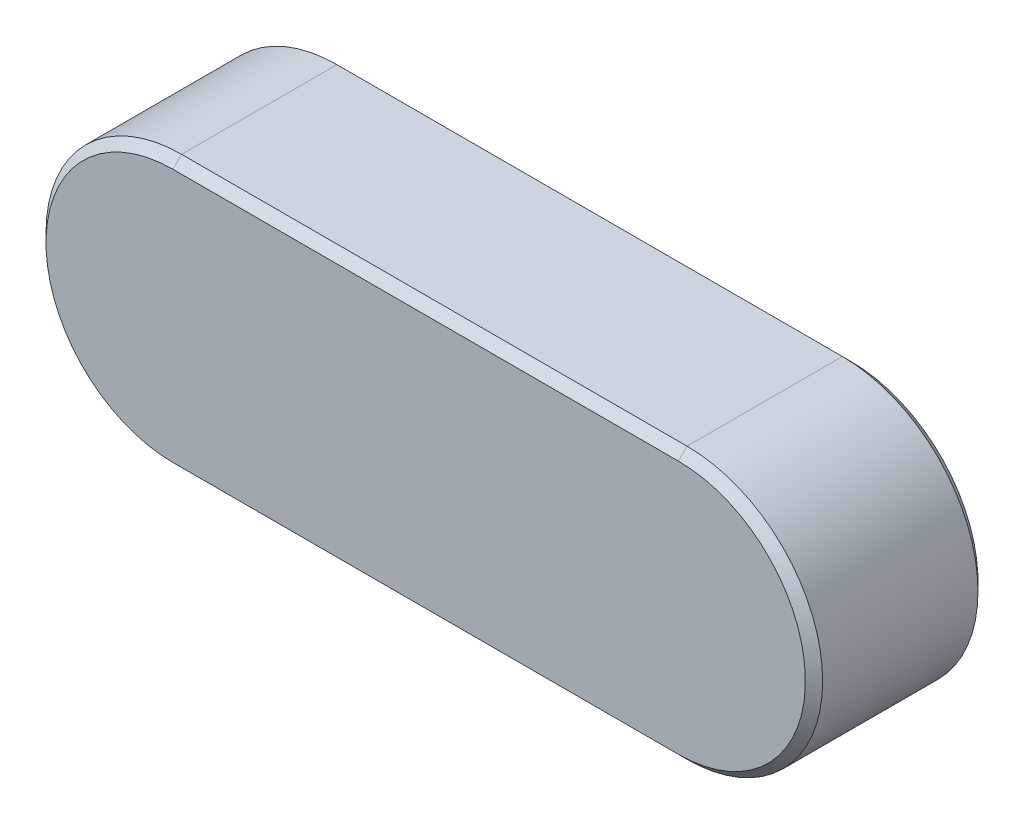
ISO-10303-21;
HEADER;
FILE_DESCRIPTION(('STEP AP214'),'2;1');
FILE_NAME('part.step','',(''),(''),'','','');
FILE_SCHEMA(('AUTOMOTIVE_DESIGN { 1 0 10303 214 1 1 1 1 }'));
ENDSEC;
DATA;
#1=APPLICATION_CONTEXT('core data for automotive mechanical design processes');
#2=APPLICATION_PROTOCOL_DEFINITION('international standard','automotive_design',2000,#1);
#3=PRODUCT_CONTEXT('',#1,'mechanical');
#4=PRODUCT('Part','Part','',(#3));
#5=PRODUCT_RELATED_PRODUCT_CATEGORY('part','',(#4));
#6=PRODUCT_DEFINITION_FORMATION('','',#4);
#7=PRODUCT_DEFINITION_CONTEXT('part definition',#1,'design');
#8=PRODUCT_DEFINITION('design','',#6,#7);
#9=PRODUCT_DEFINITION_SHAPE('','',#8);
#10=(LENGTH_UNIT() NAMED_UNIT(*) SI_UNIT(.MILLI.,.METRE.));
#11=(NAMED_UNIT(*) PLANE_ANGLE_UNIT() SI_UNIT($,.RADIAN.));
#12=(NAMED_UNIT(*) SI_UNIT($,.STERADIAN.) SOLID_ANGLE_UNIT());
#13=UNCERTAINTY_MEASURE_WITH_UNIT(LENGTH_MEASURE(1.E-05),#10,'distance_accuracy_value','');
#14=(GEOMETRIC_REPRESENTATION_CONTEXT(3) GLOBAL_UNCERTAINTY_ASSIGNED_CONTEXT((#13)) GLOBAL_UNIT_ASSIGNED_CONTEXT((#10,
#11,#12)) REPRESENTATION_CONTEXT('',''));
#15=CARTESIAN_POINT('',(0.,0.,0.));
#16=DIRECTION('',(0.,0.,1.));
#17=DIRECTION('',(1.,0.,0.));
#18=AXIS2_PLACEMENT_3D('',#15,#16,#17);
#19=CARTESIAN_POINT('',(-20.5,0.,14.));
#20=DIRECTION('',(0.,0.,-1.));
#21=DIRECTION('',(-1.,0.,0.));
#22=AXIS2_PLACEMENT_3D('',#19,#20,#21);
#23=CYLINDRICAL_SURFACE('',#22,11.);
#24=DIRECTION('',(0.,0.,-1.));
#25=VECTOR('',#24,1.);
#26=CARTESIAN_POINT('',(-20.5,11.,14.));
#27=LINE('',#26,#25);
#28=CARTESIAN_POINT('',(-20.5,11.,13.3));
#29=VERTEX_POINT('',#28);
#30=CARTESIAN_POINT('',(-20.5,11.,0.699999999999992));
#31=VERTEX_POINT('',#30);
#32=EDGE_CURVE('E153',#29,#31,#27,.T.);
#33=ORIENTED_EDGE('',*,*,#32,.T.);
#34=CARTESIAN_POINT('',(-20.5,0.,0.699999999999992));
#35=DIRECTION('',(0.,0.,1.));
#36=DIRECTION('',(1.,0.,0.));
#37=AXIS2_PLACEMENT_3D('',#34,#35,#36);
#38=CIRCLE('',#37,11.);
#39=CARTESIAN_POINT('',(-20.5,-11.,0.699999999999992));
#40=VERTEX_POINT('',#39);
#41=EDGE_CURVE('E122',#31,#40,#38,.T.);
#42=ORIENTED_EDGE('',*,*,#41,.T.);
#43=DIRECTION('',(0.,0.,-1.));
#44=VECTOR('',#43,1.);
#45=CARTESIAN_POINT('',(-20.5,-11.,14.));
#46=LINE('',#45,#44);
#47=CARTESIAN_POINT('',(-20.5,-11.,13.3));
#48=VERTEX_POINT('',#47);
#49=EDGE_CURVE('E106',#48,#40,#46,.T.);
#50=ORIENTED_EDGE('',*,*,#49,.F.);
#51=CARTESIAN_POINT('',(-20.5,0.,13.3));
#52=DIRECTION('',(0.,0.,1.));
#53=DIRECTION('',(1.,0.,0.));
#54=AXIS2_PLACEMENT_3D('',#51,#52,#53);
#55=CIRCLE('',#54,11.);
#56=EDGE_CURVE('E119',#48,#29,#55,.F.);
#57=ORIENTED_EDGE('',*,*,#56,.T.);
#58=EDGE_LOOP('',(#33,#42,#50,#57));
#59=FACE_BOUND('',#58,.T.);
#60=ADVANCED_FACE('F33',(#59),#23,.T.);
#61=CARTESIAN_POINT('',(-20.5,-11.,14.));
#62=DIRECTION('',(0.,1.,0.));
#63=DIRECTION('',(-1.,0.,0.));
#64=AXIS2_PLACEMENT_3D('',#61,#62,#63);
#65=PLANE('',#64);
#66=ORIENTED_EDGE('',*,*,#49,.T.);
#67=DIRECTION('',(1.,0.,0.));
#68=VECTOR('',#67,1.);
#69=CARTESIAN_POINT('',(-20.5,-11.,0.699999999999992));
#70=LINE('',#69,#68);
#71=CARTESIAN_POINT('',(20.5,-11.,0.699999999999992));
#72=VERTEX_POINT('',#71);
#73=EDGE_CURVE('E112',#40,#72,#70,.T.);
#74=ORIENTED_EDGE('',*,*,#73,.T.);
#75=DIRECTION('',(0.,0.,-1.));
#76=VECTOR('',#75,1.);
#77=CARTESIAN_POINT('',(20.5,-11.,14.));
#78=LINE('',#77,#76);
#79=CARTESIAN_POINT('',(20.5,-11.,13.3));
#80=VERTEX_POINT('',#79);
#81=EDGE_CURVE('E108',#80,#72,#78,.T.);
#82=ORIENTED_EDGE('',*,*,#81,.F.);
#83=DIRECTION('',(-1.,0.,0.));
#84=VECTOR('',#83,1.);
#85=CARTESIAN_POINT('',(-20.5,-11.,13.3));
#86=LINE('',#85,#84);
#87=EDGE_CURVE('E103',#80,#48,#86,.T.);
#88=ORIENTED_EDGE('',*,*,#87,.T.);
#89=EDGE_LOOP('',(#66,#74,#82,#88));
#90=FACE_BOUND('',#89,.T.);
#91=ADVANCED_FACE('F105',(#90),#65,.F.);
#92=CARTESIAN_POINT('',(20.5,0.,14.));
#93=DIRECTION('',(0.,0.,-1.));
#94=DIRECTION('',(-1.,0.,0.));
#95=AXIS2_PLACEMENT_3D('',#92,#93,#94);
#96=CYLINDRICAL_SURFACE('',#95,11.);
#97=ORIENTED_EDGE('',*,*,#81,.T.);
#98=CARTESIAN_POINT('',(20.5,0.,0.699999999999992));
#99=DIRECTION('',(0.,0.,1.));
#100=DIRECTION('',(1.,0.,0.));
#101=AXIS2_PLACEMENT_3D('',#98,#99,#100);
#102=CIRCLE('',#101,11.);
#103=CARTESIAN_POINT('',(20.5,11.,0.699999999999992));
#104=VERTEX_POINT('',#103);
#105=EDGE_CURVE('E177',#72,#104,#102,.T.);
#106=ORIENTED_EDGE('',*,*,#105,.T.);
#107=DIRECTION('',(0.,0.,-1.));
#108=VECTOR('',#107,1.);
#109=CARTESIAN_POINT('',(20.5,11.,14.));
#110=LINE('',#109,#108);
#111=CARTESIAN_POINT('',(20.5,11.,13.3));
#112=VERTEX_POINT('',#111);
#113=EDGE_CURVE('E158',#112,#104,#110,.T.);
#114=ORIENTED_EDGE('',*,*,#113,.F.);
#115=CARTESIAN_POINT('',(20.5,0.,13.3));
#116=DIRECTION('',(0.,0.,1.));
#117=DIRECTION('',(1.,0.,0.));
#118=AXIS2_PLACEMENT_3D('',#115,#116,#117);
#119=CIRCLE('',#118,11.);
#120=EDGE_CURVE('E175',#112,#80,#119,.F.);
#121=ORIENTED_EDGE('',*,*,#120,.T.);
#122=EDGE_LOOP('',(#97,#106,#114,#121));
#123=FACE_BOUND('',#122,.T.);
#124=ADVANCED_FACE('F194',(#123),#96,.T.);
#125=CARTESIAN_POINT('',(-20.5,11.,14.));
#126=DIRECTION('',(0.,-1.,0.));
#127=DIRECTION('',(0.,0.,-1.));
#128=AXIS2_PLACEMENT_3D('',#125,#126,#127);
#129=PLANE('',#128);
#130=ORIENTED_EDGE('',*,*,#113,.T.);
#131=DIRECTION('',(-1.,0.,0.));
#132=VECTOR('',#131,1.);
#133=CARTESIAN_POINT('',(-20.5,11.,0.699999999999992));
#134=LINE('',#133,#132);
#135=EDGE_CURVE('E181',#104,#31,#134,.T.);
#136=ORIENTED_EDGE('',*,*,#135,.T.);
#137=ORIENTED_EDGE('',*,*,#32,.F.);
#138=DIRECTION('',(1.,0.,0.));
#139=VECTOR('',#138,1.);
#140=CARTESIAN_POINT('',(20.5,11.,13.3));
#141=LINE('',#140,#139);
#142=EDGE_CURVE('E179',#29,#112,#141,.T.);
#143=ORIENTED_EDGE('',*,*,#142,.T.);
#144=EDGE_LOOP('',(#130,#136,#137,#143));
#145=FACE_BOUND('',#144,.T.);
#146=ADVANCED_FACE('F192',(#145),#129,.F.);
#147=CARTESIAN_POINT('',(-20.5,0.,14.));
#148=DIRECTION('',(0.,0.,1.));
#149=DIRECTION('',(1.,0.,0.));
#150=AXIS2_PLACEMENT_3D('',#147,#148,#149);
#151=PLANE('',#150);
#152=DIRECTION('',(-1.,0.,0.));
#153=VECTOR('',#152,1.);
#154=CARTESIAN_POINT('',(-20.5,10.3,14.));
#155=LINE('',#154,#153);
#156=CARTESIAN_POINT('',(20.5,10.3,14.));
#157=VERTEX_POINT('',#156);
#158=CARTESIAN_POINT('',(-20.5,10.3,14.));
#159=VERTEX_POINT('',#158);
#160=EDGE_CURVE('E57',#157,#159,#155,.T.);
#161=ORIENTED_EDGE('',*,*,#160,.T.);
#162=CARTESIAN_POINT('',(-20.5,0.,14.));
#163=DIRECTION('',(0.,0.,1.));
#164=DIRECTION('',(1.,0.,0.));
#165=AXIS2_PLACEMENT_3D('',#162,#163,#164);
#166=CIRCLE('',#165,10.3);
#167=CARTESIAN_POINT('',(-20.5,-10.3,14.));
#168=VERTEX_POINT('',#167);
#169=EDGE_CURVE('E11',#159,#168,#166,.T.);
#170=ORIENTED_EDGE('',*,*,#169,.T.);
#171=DIRECTION('',(1.,0.,0.));
#172=VECTOR('',#171,1.);
#173=CARTESIAN_POINT('',(20.5,-10.3,14.));
#174=LINE('',#173,#172);
#175=CARTESIAN_POINT('',(20.5,-10.3,14.));
#176=VERTEX_POINT('',#175);
#177=EDGE_CURVE('E42',#168,#176,#174,.T.);
#178=ORIENTED_EDGE('',*,*,#177,.T.);
#179=CARTESIAN_POINT('',(20.5,0.,14.));
#180=DIRECTION('',(0.,0.,1.));
#181=DIRECTION('',(1.,0.,0.));
#182=AXIS2_PLACEMENT_3D('',#179,#180,#181);
#183=CIRCLE('',#182,10.3);
#184=EDGE_CURVE('E183',#176,#157,#183,.T.);
#185=ORIENTED_EDGE('',*,*,#184,.T.);
#186=EDGE_LOOP('',(#161,#170,#178,#185));
#187=FACE_BOUND('',#186,.T.);
#188=ADVANCED_FACE('F186',(#187),#151,.T.);
#189=CARTESIAN_POINT('',(-20.5,0.,0.));
#190=DIRECTION('',(0.,0.,1.));
#191=DIRECTION('',(1.,0.,0.));
#192=AXIS2_PLACEMENT_3D('',#189,#190,#191);
#193=PLANE('',#192);
#194=DIRECTION('',(-1.,0.,0.));
#195=VECTOR('',#194,1.);
#196=CARTESIAN_POINT('',(-20.5,-10.3,0.));
#197=LINE('',#196,#195);
#198=CARTESIAN_POINT('',(20.5,-10.3,0.));
#199=VERTEX_POINT('',#198);
#200=CARTESIAN_POINT('',(-20.5,-10.3,0.));
#201=VERTEX_POINT('',#200);
#202=EDGE_CURVE('E170',#199,#201,#197,.T.);
#203=ORIENTED_EDGE('',*,*,#202,.T.);
#204=CARTESIAN_POINT('',(-20.5,0.,0.));
#205=DIRECTION('',(0.,0.,1.));
#206=DIRECTION('',(1.,0.,0.));
#207=AXIS2_PLACEMENT_3D('',#204,#205,#206);
#208=CIRCLE('',#207,10.3);
#209=CARTESIAN_POINT('',(-20.5,10.3,0.));
#210=VERTEX_POINT('',#209);
#211=EDGE_CURVE('E113',#201,#210,#208,.F.);
#212=ORIENTED_EDGE('',*,*,#211,.T.);
#213=DIRECTION('',(1.,0.,0.));
#214=VECTOR('',#213,1.);
#215=CARTESIAN_POINT('',(-20.5,10.3,0.));
#216=LINE('',#215,#214);
#217=CARTESIAN_POINT('',(20.5,10.3,0.));
#218=VERTEX_POINT('',#217);
#219=EDGE_CURVE('E166',#210,#218,#216,.T.);
#220=ORIENTED_EDGE('',*,*,#219,.T.);
#221=CARTESIAN_POINT('',(20.5,0.,0.));
#222=DIRECTION('',(0.,0.,1.));
#223=DIRECTION('',(1.,0.,0.));
#224=AXIS2_PLACEMENT_3D('',#221,#222,#223);
#225=CIRCLE('',#224,10.3);
#226=EDGE_CURVE('E168',#218,#199,#225,.F.);
#227=ORIENTED_EDGE('',*,*,#226,.T.);
#228=EDGE_LOOP('',(#203,#212,#220,#227));
#229=FACE_BOUND('',#228,.T.);
#230=ADVANCED_FACE('F220',(#229),#193,.F.);
#231=CARTESIAN_POINT('',(20.5,0.,0.699999999999992));
#232=DIRECTION('',(0.,0.,1.));
#233=DIRECTION('',(1.,0.,0.));
#234=AXIS2_PLACEMENT_3D('',#231,#232,#233);
#235=CONICAL_SURFACE('',#234,11.,0.785398163397448);
#236=DIRECTION('',(0.,-0.707106781186548,0.707106781186548));
#237=VECTOR('',#236,1.);
#238=CARTESIAN_POINT('',(20.5,-10.3,0.));
#239=LINE('',#238,#237);
#240=EDGE_CURVE('E145',#199,#72,#239,.T.);
#241=ORIENTED_EDGE('',*,*,#240,.F.);
#242=ORIENTED_EDGE('',*,*,#226,.F.);
#243=DIRECTION('',(0.,-0.707106781186548,-0.707106781186548));
#244=VECTOR('',#243,1.);
#245=CARTESIAN_POINT('',(20.5,11.,0.699999999999992));
#246=LINE('',#245,#244);
#247=EDGE_CURVE('E133',#104,#218,#246,.T.);
#248=ORIENTED_EDGE('',*,*,#247,.F.);
#249=ORIENTED_EDGE('',*,*,#105,.F.);
#250=EDGE_LOOP('',(#241,#242,#248,#249));
#251=FACE_BOUND('',#250,.T.);
#252=ADVANCED_FACE('F197',(#251),#235,.T.);
#253=CARTESIAN_POINT('',(-20.5,11.,0.699999999999992));
#254=DIRECTION('',(0.,-0.707106781186548,0.707106781186548));
#255=DIRECTION('',(-1.,0.,0.));
#256=AXIS2_PLACEMENT_3D('',#253,#254,#255);
#257=PLANE('',#256);
#258=ORIENTED_EDGE('',*,*,#247,.T.);
#259=ORIENTED_EDGE('',*,*,#219,.F.);
#260=DIRECTION('',(0.,-0.707106781186548,-0.707106781186548));
#261=VECTOR('',#260,1.);
#262=CARTESIAN_POINT('',(-20.5,11.,0.699999999999992));
#263=LINE('',#262,#261);
#264=EDGE_CURVE('E139',#31,#210,#263,.T.);
#265=ORIENTED_EDGE('',*,*,#264,.F.);
#266=ORIENTED_EDGE('',*,*,#135,.F.);
#267=EDGE_LOOP('',(#258,#259,#265,#266));
#268=FACE_BOUND('',#267,.T.);
#269=ADVANCED_FACE('F199',(#268),#257,.F.);
#270=CARTESIAN_POINT('',(-20.5,-11.,0.699999999999992));
#271=DIRECTION('',(0.,0.707106781186548,0.707106781186548));
#272=DIRECTION('',(1.,0.,0.));
#273=AXIS2_PLACEMENT_3D('',#270,#271,#272);
#274=PLANE('',#273);
#275=ORIENTED_EDGE('',*,*,#240,.T.);
#276=ORIENTED_EDGE('',*,*,#73,.F.);
#277=DIRECTION('',(0.,-0.707106781186548,0.707106781186548));
#278=VECTOR('',#277,1.);
#279=CARTESIAN_POINT('',(-20.5,-10.3,0.));
#280=LINE('',#279,#278);
#281=EDGE_CURVE('E136',#201,#40,#280,.T.);
#282=ORIENTED_EDGE('',*,*,#281,.F.);
#283=ORIENTED_EDGE('',*,*,#202,.F.);
#284=EDGE_LOOP('',(#275,#276,#282,#283));
#285=FACE_BOUND('',#284,.T.);
#286=ADVANCED_FACE('F202',(#285),#274,.F.);
#287=CARTESIAN_POINT('',(-20.5,0.,0.699999999999992));
#288=DIRECTION('',(0.,0.,1.));
#289=DIRECTION('',(1.,0.,0.));
#290=AXIS2_PLACEMENT_3D('',#287,#288,#289);
#291=CONICAL_SURFACE('',#290,11.,0.785398163397448);
#292=ORIENTED_EDGE('',*,*,#264,.T.);
#293=ORIENTED_EDGE('',*,*,#211,.F.);
#294=ORIENTED_EDGE('',*,*,#281,.T.);
#295=ORIENTED_EDGE('',*,*,#41,.F.);
#296=EDGE_LOOP('',(#292,#293,#294,#295));
#297=FACE_BOUND('',#296,.T.);
#298=ADVANCED_FACE('F200',(#297),#291,.T.);
#299=CARTESIAN_POINT('',(20.5,0.,14.));
#300=DIRECTION('',(0.,0.,-1.));
#301=DIRECTION('',(-1.,0.,0.));
#302=AXIS2_PLACEMENT_3D('',#299,#300,#301);
#303=CONICAL_SURFACE('',#302,10.3,0.785398163397447);
#304=DIRECTION('',(0.,0.707106781186547,0.707106781186548));
#305=VECTOR('',#304,1.);
#306=CARTESIAN_POINT('',(20.5,-11.,13.3));
#307=LINE('',#306,#305);
#308=EDGE_CURVE('E130',#80,#176,#307,.T.);
#309=ORIENTED_EDGE('',*,*,#308,.F.);
#310=ORIENTED_EDGE('',*,*,#120,.F.);
#311=DIRECTION('',(0.,0.707106781186547,-0.707106781186548));
#312=VECTOR('',#311,1.);
#313=CARTESIAN_POINT('',(20.5,10.3,14.));
#314=LINE('',#313,#312);
#315=EDGE_CURVE('E37',#157,#112,#314,.T.);
#316=ORIENTED_EDGE('',*,*,#315,.F.);
#317=ORIENTED_EDGE('',*,*,#184,.F.);
#318=EDGE_LOOP('',(#309,#310,#316,#317));
#319=FACE_BOUND('',#318,.T.);
#320=ADVANCED_FACE('F35',(#319),#303,.T.);
#321=CARTESIAN_POINT('',(-20.5,10.3,14.));
#322=DIRECTION('',(0.,0.707106781186548,0.707106781186547));
#323=DIRECTION('',(1.,0.,0.));
#324=AXIS2_PLACEMENT_3D('',#321,#322,#323);
#325=PLANE('',#324);
#326=ORIENTED_EDGE('',*,*,#315,.T.);
#327=ORIENTED_EDGE('',*,*,#142,.F.);
#328=DIRECTION('',(0.,0.707106781186547,-0.707106781186548));
#329=VECTOR('',#328,1.);
#330=CARTESIAN_POINT('',(-20.5,10.3,14.));
#331=LINE('',#330,#329);
#332=EDGE_CURVE('E125',#159,#29,#331,.T.);
#333=ORIENTED_EDGE('',*,*,#332,.F.);
#334=ORIENTED_EDGE('',*,*,#160,.F.);
#335=EDGE_LOOP('',(#326,#327,#333,#334));
#336=FACE_BOUND('',#335,.T.);
#337=ADVANCED_FACE('F189',(#336),#325,.T.);
#338=CARTESIAN_POINT('',(-20.5,-10.3,14.));
#339=DIRECTION('',(0.,-0.707106781186548,0.707106781186547));
#340=DIRECTION('',(-1.,0.,0.));
#341=AXIS2_PLACEMENT_3D('',#338,#339,#340);
#342=PLANE('',#341);
#343=ORIENTED_EDGE('',*,*,#308,.T.);
#344=ORIENTED_EDGE('',*,*,#177,.F.);
#345=DIRECTION('',(0.,0.707106781186547,0.707106781186548));
#346=VECTOR('',#345,1.);
#347=CARTESIAN_POINT('',(-20.5,-11.,13.3));
#348=LINE('',#347,#346);
#349=EDGE_CURVE('E50',#48,#168,#348,.T.);
#350=ORIENTED_EDGE('',*,*,#349,.F.);
#351=ORIENTED_EDGE('',*,*,#87,.F.);
#352=EDGE_LOOP('',(#343,#344,#350,#351));
#353=FACE_BOUND('',#352,.T.);
#354=ADVANCED_FACE('F128',(#353),#342,.T.);
#355=CARTESIAN_POINT('',(-20.5,0.,14.));
#356=DIRECTION('',(0.,0.,-1.));
#357=DIRECTION('',(-1.,0.,0.));
#358=AXIS2_PLACEMENT_3D('',#355,#356,#357);
#359=CONICAL_SURFACE('',#358,10.3,0.785398163397447);
#360=ORIENTED_EDGE('',*,*,#332,.T.);
#361=ORIENTED_EDGE('',*,*,#56,.F.);
#362=ORIENTED_EDGE('',*,*,#349,.T.);
#363=ORIENTED_EDGE('',*,*,#169,.F.);
#364=EDGE_LOOP('',(#360,#361,#362,#363));
#365=FACE_BOUND('',#364,.T.);
#366=ADVANCED_FACE('F124',(#365),#359,.T.);
#367=CLOSED_SHELL('',(#60,#91,#124,#146,#188,#230,#252,#269,#286,#298,#320,#337,#354,#366));
#368=MANIFOLD_SOLID_BREP('B2',#367);
#369=ADVANCED_BREP_SHAPE_REPRESENTATION('',(#18,#368),#14);
#370=SHAPE_DEFINITION_REPRESENTATION(#9,#369);
ENDSEC;
END-ISO-10303-21;
